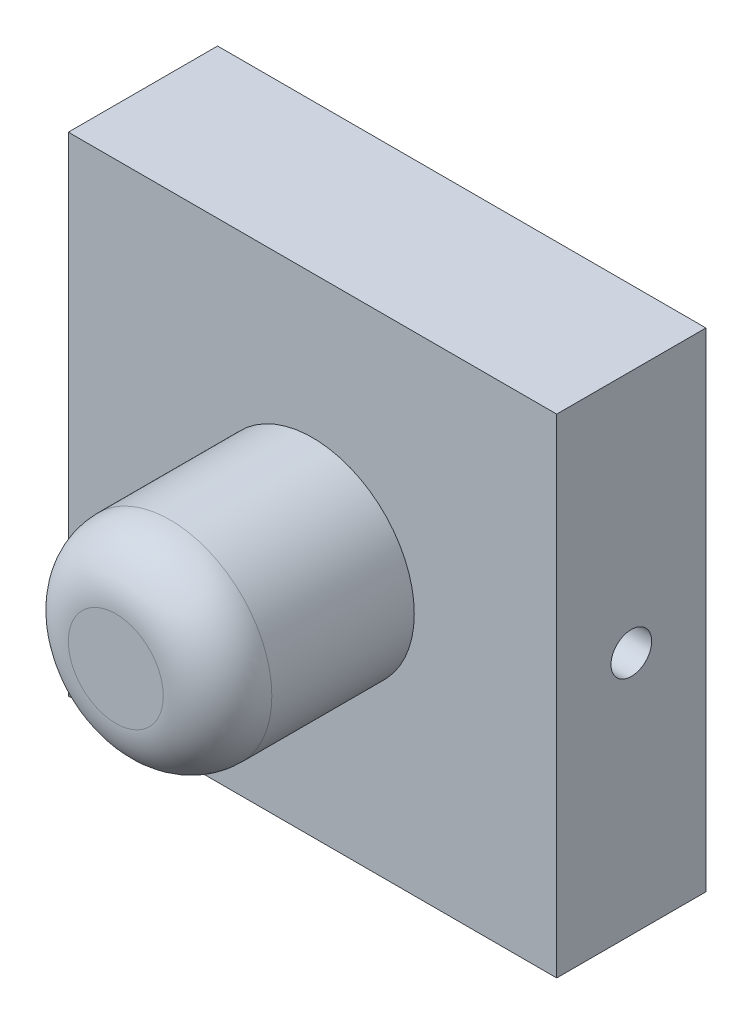
ISO-10303-21;
HEADER;
FILE_DESCRIPTION(('STEP AP214'),'2;1');
FILE_NAME('part.step','',(''),(''),'','','');
FILE_SCHEMA(('AUTOMOTIVE_DESIGN { 1 0 10303 214 1 1 1 1 }'));
ENDSEC;
DATA;
#1=APPLICATION_CONTEXT('core data for automotive mechanical design processes');
#2=APPLICATION_PROTOCOL_DEFINITION('international standard','automotive_design',2000,#1);
#3=PRODUCT_CONTEXT('',#1,'mechanical');
#4=PRODUCT('Part','Part','',(#3));
#5=PRODUCT_RELATED_PRODUCT_CATEGORY('part','',(#4));
#6=PRODUCT_DEFINITION_FORMATION('','',#4);
#7=PRODUCT_DEFINITION_CONTEXT('part definition',#1,'design');
#8=PRODUCT_DEFINITION('design','',#6,#7);
#9=PRODUCT_DEFINITION_SHAPE('','',#8);
#10=(LENGTH_UNIT() NAMED_UNIT(*) SI_UNIT(.MILLI.,.METRE.));
#11=(NAMED_UNIT(*) PLANE_ANGLE_UNIT() SI_UNIT($,.RADIAN.));
#12=(NAMED_UNIT(*) SI_UNIT($,.STERADIAN.) SOLID_ANGLE_UNIT());
#13=UNCERTAINTY_MEASURE_WITH_UNIT(LENGTH_MEASURE(1.E-05),#10,'distance_accuracy_value','');
#14=(GEOMETRIC_REPRESENTATION_CONTEXT(3) GLOBAL_UNCERTAINTY_ASSIGNED_CONTEXT((#13)) GLOBAL_UNIT_ASSIGNED_CONTEXT((#10,
#11,#12)) REPRESENTATION_CONTEXT('',''));
#15=CARTESIAN_POINT('',(0.,0.,0.));
#16=DIRECTION('',(0.,0.,1.));
#17=DIRECTION('',(1.,0.,0.));
#18=AXIS2_PLACEMENT_3D('',#15,#16,#17);
#19=CARTESIAN_POINT('',(18.,-18.,-5.5));
#20=DIRECTION('',(0.,0.,1.));
#21=DIRECTION('',(1.,0.,0.));
#22=AXIS2_PLACEMENT_3D('',#19,#20,#21);
#23=PLANE('',#22);
#24=DIRECTION('',(0.,1.,0.));
#25=VECTOR('',#24,1.);
#26=CARTESIAN_POINT('',(-18.,-18.,-5.5));
#27=LINE('',#26,#25);
#28=CARTESIAN_POINT('',(-18.,-18.,-5.5));
#29=VERTEX_POINT('',#28);
#30=CARTESIAN_POINT('',(-18.,18.,-5.5));
#31=VERTEX_POINT('',#30);
#32=EDGE_CURVE('E103',#29,#31,#27,.T.);
#33=ORIENTED_EDGE('',*,*,#32,.T.);
#34=DIRECTION('',(-1.,0.,0.));
#35=VECTOR('',#34,1.);
#36=CARTESIAN_POINT('',(18.,18.,-5.5));
#37=LINE('',#36,#35);
#38=CARTESIAN_POINT('',(18.,18.,-5.5));
#39=VERTEX_POINT('',#38);
#40=EDGE_CURVE('E94',#39,#31,#37,.T.);
#41=ORIENTED_EDGE('',*,*,#40,.F.);
#42=DIRECTION('',(0.,1.,0.));
#43=VECTOR('',#42,1.);
#44=CARTESIAN_POINT('',(18.,-18.,-5.5));
#45=LINE('',#44,#43);
#46=CARTESIAN_POINT('',(18.,-18.,-5.5));
#47=VERTEX_POINT('',#46);
#48=EDGE_CURVE('E88',#47,#39,#45,.T.);
#49=ORIENTED_EDGE('',*,*,#48,.F.);
#50=DIRECTION('',(-1.,0.,0.));
#51=VECTOR('',#50,1.);
#52=CARTESIAN_POINT('',(18.,-18.,-5.5));
#53=LINE('',#52,#51);
#54=EDGE_CURVE('E99',#47,#29,#53,.T.);
#55=ORIENTED_EDGE('',*,*,#54,.T.);
#56=EDGE_LOOP('',(#33,#41,#49,#55));
#57=FACE_BOUND('',#56,.T.);
#58=ADVANCED_FACE('F35',(#57),#23,.F.);
#59=CARTESIAN_POINT('',(18.,18.,5.5));
#60=DIRECTION('',(0.,-1.,0.));
#61=DIRECTION('',(0.,0.,-1.));
#62=AXIS2_PLACEMENT_3D('',#59,#60,#61);
#63=PLANE('',#62);
#64=DIRECTION('',(0.,0.,1.));
#65=VECTOR('',#64,1.);
#66=CARTESIAN_POINT('',(-18.,18.,5.5));
#67=LINE('',#66,#65);
#68=CARTESIAN_POINT('',(-18.,18.,5.5));
#69=VERTEX_POINT('',#68);
#70=EDGE_CURVE('E93',#31,#69,#67,.T.);
#71=ORIENTED_EDGE('',*,*,#70,.T.);
#72=DIRECTION('',(-1.,0.,0.));
#73=VECTOR('',#72,1.);
#74=CARTESIAN_POINT('',(18.,18.,5.5));
#75=LINE('',#74,#73);
#76=CARTESIAN_POINT('',(18.,18.,5.5));
#77=VERTEX_POINT('',#76);
#78=EDGE_CURVE('E91',#77,#69,#75,.T.);
#79=ORIENTED_EDGE('',*,*,#78,.F.);
#80=DIRECTION('',(0.,0.,1.));
#81=VECTOR('',#80,1.);
#82=CARTESIAN_POINT('',(18.,18.,5.5));
#83=LINE('',#82,#81);
#84=EDGE_CURVE('E83',#39,#77,#83,.T.);
#85=ORIENTED_EDGE('',*,*,#84,.F.);
#86=ORIENTED_EDGE('',*,*,#40,.T.);
#87=EDGE_LOOP('',(#71,#79,#85,#86));
#88=FACE_BOUND('',#87,.T.);
#89=ADVANCED_FACE('F92',(#88),#63,.F.);
#90=CARTESIAN_POINT('',(18.,-18.,5.5));
#91=DIRECTION('',(0.,0.,-1.));
#92=DIRECTION('',(-1.,0.,0.));
#93=AXIS2_PLACEMENT_3D('',#90,#91,#92);
#94=PLANE('',#93);
#95=CARTESIAN_POINT('',(0.,0.,5.5));
#96=DIRECTION('',(0.,0.,-1.));
#97=DIRECTION('',(-1.,0.,0.));
#98=AXIS2_PLACEMENT_3D('',#95,#96,#97);
#99=CIRCLE('',#98,7.5);
#100=CARTESIAN_POINT('',(-7.5,0.,5.5));
#101=VERTEX_POINT('',#100);
#102=EDGE_CURVE('E113',#101,#101,#99,.F.);
#103=ORIENTED_EDGE('',*,*,#102,.F.);
#104=EDGE_LOOP('',(#103));
#105=FACE_BOUND('',#104,.T.);
#106=DIRECTION('',(0.,-1.,0.));
#107=VECTOR('',#106,1.);
#108=CARTESIAN_POINT('',(-18.,-18.,5.5));
#109=LINE('',#108,#107);
#110=CARTESIAN_POINT('',(-18.,-18.,5.5));
#111=VERTEX_POINT('',#110);
#112=EDGE_CURVE('E69',#69,#111,#109,.T.);
#113=ORIENTED_EDGE('',*,*,#112,.T.);
#114=DIRECTION('',(-1.,0.,0.));
#115=VECTOR('',#114,1.);
#116=CARTESIAN_POINT('',(18.,-18.,5.5));
#117=LINE('',#116,#115);
#118=CARTESIAN_POINT('',(18.,-18.,5.5));
#119=VERTEX_POINT('',#118);
#120=EDGE_CURVE('E95',#119,#111,#117,.T.);
#121=ORIENTED_EDGE('',*,*,#120,.F.);
#122=DIRECTION('',(0.,-1.,0.));
#123=VECTOR('',#122,1.);
#124=CARTESIAN_POINT('',(18.,-18.,5.5));
#125=LINE('',#124,#123);
#126=EDGE_CURVE('E86',#77,#119,#125,.T.);
#127=ORIENTED_EDGE('',*,*,#126,.F.);
#128=ORIENTED_EDGE('',*,*,#78,.T.);
#129=EDGE_LOOP('',(#113,#121,#127,#128));
#130=FACE_BOUND('',#129,.T.);
#131=ADVANCED_FACE('F97',(#105,#130),#94,.F.);
#132=CARTESIAN_POINT('',(18.,-18.,5.5));
#133=DIRECTION('',(0.,1.,0.));
#134=DIRECTION('',(0.,0.,1.));
#135=AXIS2_PLACEMENT_3D('',#132,#133,#134);
#136=PLANE('',#135);
#137=DIRECTION('',(0.,0.,-1.));
#138=VECTOR('',#137,1.);
#139=CARTESIAN_POINT('',(-18.,-18.,5.5));
#140=LINE('',#139,#138);
#141=EDGE_CURVE('E75',#111,#29,#140,.T.);
#142=ORIENTED_EDGE('',*,*,#141,.T.);
#143=ORIENTED_EDGE('',*,*,#54,.F.);
#144=DIRECTION('',(0.,0.,-1.));
#145=VECTOR('',#144,1.);
#146=CARTESIAN_POINT('',(18.,-18.,5.5));
#147=LINE('',#146,#145);
#148=EDGE_CURVE('E52',#119,#47,#147,.T.);
#149=ORIENTED_EDGE('',*,*,#148,.F.);
#150=ORIENTED_EDGE('',*,*,#120,.T.);
#151=EDGE_LOOP('',(#142,#143,#149,#150));
#152=FACE_BOUND('',#151,.T.);
#153=ADVANCED_FACE('F141',(#152),#136,.F.);
#154=CARTESIAN_POINT('',(18.,0.,0.));
#155=DIRECTION('',(-1.,0.,0.));
#156=DIRECTION('',(0.,0.,1.));
#157=AXIS2_PLACEMENT_3D('',#154,#155,#156);
#158=PLANE('',#157);
#159=CARTESIAN_POINT('',(18.,0.,0.));
#160=DIRECTION('',(-1.,0.,0.));
#161=DIRECTION('',(0.,0.,1.));
#162=AXIS2_PLACEMENT_3D('',#159,#160,#161);
#163=CIRCLE('',#162,1.5);
#164=CARTESIAN_POINT('',(18.,0.,1.5));
#165=VERTEX_POINT('',#164);
#166=EDGE_CURVE('E106',#165,#165,#163,.T.);
#167=ORIENTED_EDGE('',*,*,#166,.T.);
#168=EDGE_LOOP('',(#167));
#169=FACE_BOUND('',#168,.T.);
#170=ORIENTED_EDGE('',*,*,#48,.T.);
#171=ORIENTED_EDGE('',*,*,#84,.T.);
#172=ORIENTED_EDGE('',*,*,#126,.T.);
#173=ORIENTED_EDGE('',*,*,#148,.T.);
#174=EDGE_LOOP('',(#170,#171,#172,#173));
#175=FACE_BOUND('',#174,.T.);
#176=ADVANCED_FACE('F84',(#169,#175),#158,.F.);
#177=CARTESIAN_POINT('',(-18.,0.,0.));
#178=DIRECTION('',(-1.,0.,0.));
#179=DIRECTION('',(0.,0.,1.));
#180=AXIS2_PLACEMENT_3D('',#177,#178,#179);
#181=PLANE('',#180);
#182=CARTESIAN_POINT('',(-18.,0.,0.));
#183=DIRECTION('',(-1.,0.,0.));
#184=DIRECTION('',(0.,0.,1.));
#185=AXIS2_PLACEMENT_3D('',#182,#183,#184);
#186=CIRCLE('',#185,1.5);
#187=CARTESIAN_POINT('',(-18.,0.,1.5));
#188=VERTEX_POINT('',#187);
#189=EDGE_CURVE('E214',#188,#188,#186,.T.);
#190=ORIENTED_EDGE('',*,*,#189,.F.);
#191=EDGE_LOOP('',(#190));
#192=FACE_BOUND('',#191,.T.);
#193=ORIENTED_EDGE('',*,*,#32,.F.);
#194=ORIENTED_EDGE('',*,*,#141,.F.);
#195=ORIENTED_EDGE('',*,*,#112,.F.);
#196=ORIENTED_EDGE('',*,*,#70,.F.);
#197=EDGE_LOOP('',(#193,#194,#195,#196));
#198=FACE_BOUND('',#197,.T.);
#199=ADVANCED_FACE('F145',(#192,#198),#181,.T.);
#200=CARTESIAN_POINT('',(0.,0.,20.));
#201=DIRECTION('',(0.,0.,-1.));
#202=DIRECTION('',(-1.,0.,0.));
#203=AXIS2_PLACEMENT_3D('',#200,#201,#202);
#204=CYLINDRICAL_SURFACE('',#203,7.5);
#205=CARTESIAN_POINT('',(0.,0.,16.));
#206=DIRECTION('',(0.,0.,1.));
#207=DIRECTION('',(1.,0.,0.));
#208=AXIS2_PLACEMENT_3D('',#205,#206,#207);
#209=CIRCLE('',#208,7.5);
#210=CARTESIAN_POINT('',(7.5,0.,16.));
#211=VERTEX_POINT('',#210);
#212=EDGE_CURVE('E11',#211,#211,#209,.F.);
#213=ORIENTED_EDGE('',*,*,#212,.T.);
#214=EDGE_LOOP('',(#213));
#215=FACE_BOUND('',#214,.T.);
#216=ORIENTED_EDGE('',*,*,#102,.T.);
#217=EDGE_LOOP('',(#216));
#218=FACE_BOUND('',#217,.T.);
#219=ADVANCED_FACE('F129',(#215,#218),#204,.T.);
#220=CARTESIAN_POINT('',(0.,0.,20.));
#221=DIRECTION('',(0.,0.,1.));
#222=DIRECTION('',(1.,0.,0.));
#223=AXIS2_PLACEMENT_3D('',#220,#221,#222);
#224=PLANE('',#223);
#225=CARTESIAN_POINT('',(0.,0.,20.));
#226=DIRECTION('',(0.,0.,1.));
#227=DIRECTION('',(1.,0.,0.));
#228=AXIS2_PLACEMENT_3D('',#225,#226,#227);
#229=CIRCLE('',#228,3.5);
#230=CARTESIAN_POINT('',(3.5,0.,20.));
#231=VERTEX_POINT('',#230);
#232=EDGE_CURVE('E44',#231,#231,#229,.T.);
#233=ORIENTED_EDGE('',*,*,#232,.T.);
#234=EDGE_LOOP('',(#233));
#235=FACE_BOUND('',#234,.T.);
#236=ADVANCED_FACE('F118',(#235),#224,.T.);
#237=CARTESIAN_POINT('',(0.,0.,16.));
#238=DIRECTION('',(0.,0.,1.));
#239=DIRECTION('',(1.,0.,0.));
#240=AXIS2_PLACEMENT_3D('',#237,#238,#239);
#241=DEGENERATE_TOROIDAL_SURFACE('',#240,3.5,4.,.T.);
#242=ORIENTED_EDGE('',*,*,#212,.F.);
#243=EDGE_LOOP('',(#242));
#244=FACE_BOUND('',#243,.T.);
#245=ORIENTED_EDGE('',*,*,#232,.F.);
#246=EDGE_LOOP('',(#245));
#247=FACE_BOUND('',#246,.T.);
#248=ADVANCED_FACE('F37',(#244,#247),#241,.T.);
#249=CARTESIAN_POINT('',(18.,0.,0.));
#250=DIRECTION('',(-1.,0.,0.));
#251=DIRECTION('',(0.,0.,1.));
#252=AXIS2_PLACEMENT_3D('',#249,#250,#251);
#253=CYLINDRICAL_SURFACE('',#252,1.5);
#254=ORIENTED_EDGE('',*,*,#166,.F.);
#255=EDGE_LOOP('',(#254));
#256=FACE_BOUND('',#255,.T.);
#257=ORIENTED_EDGE('',*,*,#189,.T.);
#258=EDGE_LOOP('',(#257));
#259=FACE_BOUND('',#258,.T.);
#260=ADVANCED_FACE('F121',(#256,#259),#253,.F.);
#261=CLOSED_SHELL('',(#58,#89,#131,#153,#176,#199,#219,#236,#248,#260));
#262=MANIFOLD_SOLID_BREP('B2',#261);
#263=ADVANCED_BREP_SHAPE_REPRESENTATION('',(#18,#262),#14);
#264=SHAPE_DEFINITION_REPRESENTATION(#9,#263);
ENDSEC;
END-ISO-10303-21;
